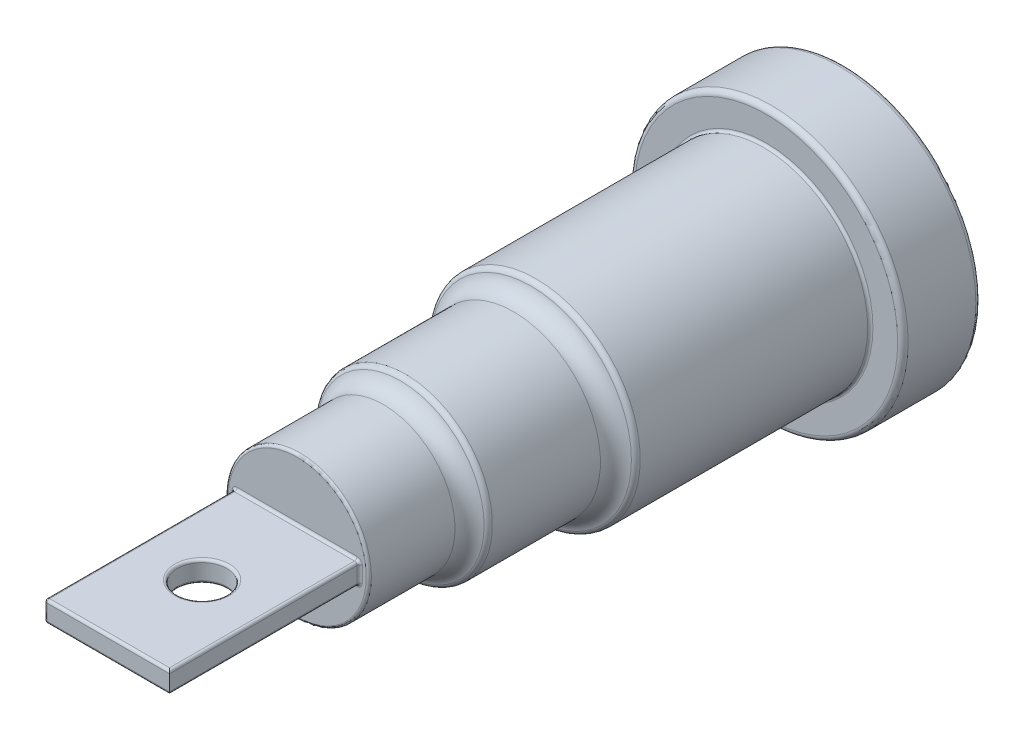
ISO-10303-21;
HEADER;
FILE_DESCRIPTION(('STEP AP214'),'2;1');
FILE_NAME('part.step','',(''),(''),'','','');
FILE_SCHEMA(('AUTOMOTIVE_DESIGN { 1 0 10303 214 1 1 1 1 }'));
ENDSEC;
DATA;
#1=APPLICATION_CONTEXT('core data for automotive mechanical design processes');
#2=APPLICATION_PROTOCOL_DEFINITION('international standard','automotive_design',2000,#1);
#3=PRODUCT_CONTEXT('',#1,'mechanical');
#4=PRODUCT('Part','Part','',(#3));
#5=PRODUCT_RELATED_PRODUCT_CATEGORY('part','',(#4));
#6=PRODUCT_DEFINITION_FORMATION('','',#4);
#7=PRODUCT_DEFINITION_CONTEXT('part definition',#1,'design');
#8=PRODUCT_DEFINITION('design','',#6,#7);
#9=PRODUCT_DEFINITION_SHAPE('','',#8);
#10=(LENGTH_UNIT() NAMED_UNIT(*) SI_UNIT(.MILLI.,.METRE.));
#11=(NAMED_UNIT(*) PLANE_ANGLE_UNIT() SI_UNIT($,.RADIAN.));
#12=(NAMED_UNIT(*) SI_UNIT($,.STERADIAN.) SOLID_ANGLE_UNIT());
#13=UNCERTAINTY_MEASURE_WITH_UNIT(LENGTH_MEASURE(1.E-05),#10,'distance_accuracy_value','');
#14=(GEOMETRIC_REPRESENTATION_CONTEXT(3) GLOBAL_UNCERTAINTY_ASSIGNED_CONTEXT((#13)) GLOBAL_UNIT_ASSIGNED_CONTEXT((#10,
#11,#12)) REPRESENTATION_CONTEXT('',''));
#15=CARTESIAN_POINT('',(0.,0.,0.));
#16=DIRECTION('',(0.,0.,1.));
#17=DIRECTION('',(1.,0.,0.));
#18=AXIS2_PLACEMENT_3D('',#15,#16,#17);
#19=CARTESIAN_POINT('',(0.,0.,3.));
#20=DIRECTION('',(0.,0.,-1.));
#21=DIRECTION('',(-1.,0.,0.));
#22=AXIS2_PLACEMENT_3D('',#19,#20,#21);
#23=CYLINDRICAL_SURFACE('',#22,5.25);
#24=CARTESIAN_POINT('',(0.,0.,2.8));
#25=DIRECTION('',(0.,0.,1.));
#26=DIRECTION('',(1.,0.,0.));
#27=AXIS2_PLACEMENT_3D('',#24,#25,#26);
#28=CIRCLE('',#27,5.25);
#29=CARTESIAN_POINT('',(5.25,0.,2.8));
#30=VERTEX_POINT('',#29);
#31=EDGE_CURVE('E327',#30,#30,#28,.F.);
#32=ORIENTED_EDGE('',*,*,#31,.T.);
#33=EDGE_LOOP('',(#32));
#34=FACE_BOUND('',#33,.T.);
#35=CARTESIAN_POINT('',(0.,0.,0.2));
#36=DIRECTION('',(0.,0.,1.));
#37=DIRECTION('',(1.,0.,0.));
#38=AXIS2_PLACEMENT_3D('',#35,#36,#37);
#39=CIRCLE('',#38,5.25);
#40=CARTESIAN_POINT('',(5.25,0.,0.2));
#41=VERTEX_POINT('',#40);
#42=EDGE_CURVE('E324',#41,#41,#39,.T.);
#43=ORIENTED_EDGE('',*,*,#42,.T.);
#44=EDGE_LOOP('',(#43));
#45=FACE_BOUND('',#44,.T.);
#46=ADVANCED_FACE('F49',(#34,#45),#23,.T.);
#47=CARTESIAN_POINT('',(0.,0.,3.));
#48=DIRECTION('',(0.,0.,1.));
#49=DIRECTION('',(1.,0.,0.));
#50=AXIS2_PLACEMENT_3D('',#47,#48,#49);
#51=PLANE('',#50);
#52=CARTESIAN_POINT('',(0.,0.,3.));
#53=DIRECTION('',(0.,0.,1.));
#54=DIRECTION('',(1.,0.,0.));
#55=AXIS2_PLACEMENT_3D('',#52,#53,#54);
#56=CIRCLE('',#55,5.05);
#57=CARTESIAN_POINT('',(5.05,0.,3.));
#58=VERTEX_POINT('',#57);
#59=EDGE_CURVE('E321',#58,#58,#56,.T.);
#60=ORIENTED_EDGE('',*,*,#59,.T.);
#61=EDGE_LOOP('',(#60));
#62=FACE_BOUND('',#61,.T.);
#63=CARTESIAN_POINT('',(0.,0.,3.));
#64=DIRECTION('',(0.,0.,1.));
#65=DIRECTION('',(1.,0.,0.));
#66=AXIS2_PLACEMENT_3D('',#63,#64,#65);
#67=CIRCLE('',#66,4.1);
#68=CARTESIAN_POINT('',(4.1,0.,3.));
#69=VERTEX_POINT('',#68);
#70=EDGE_CURVE('E300',#69,#69,#67,.F.);
#71=ORIENTED_EDGE('',*,*,#70,.T.);
#72=EDGE_LOOP('',(#71));
#73=FACE_BOUND('',#72,.T.);
#74=ADVANCED_FACE('F349',(#62,#73),#51,.T.);
#75=CARTESIAN_POINT('',(0.,0.,0.));
#76=DIRECTION('',(0.,0.,1.));
#77=DIRECTION('',(1.,0.,0.));
#78=AXIS2_PLACEMENT_3D('',#75,#76,#77);
#79=PLANE('',#78);
#80=CARTESIAN_POINT('',(0.,0.,0.));
#81=DIRECTION('',(0.,0.,1.));
#82=DIRECTION('',(1.,0.,0.));
#83=AXIS2_PLACEMENT_3D('',#80,#81,#82);
#84=CIRCLE('',#83,3.5);
#85=CARTESIAN_POINT('',(3.5,0.,0.));
#86=VERTEX_POINT('',#85);
#87=EDGE_CURVE('E11',#86,#86,#84,.T.);
#88=ORIENTED_EDGE('',*,*,#87,.T.);
#89=EDGE_LOOP('',(#88));
#90=FACE_BOUND('',#89,.T.);
#91=CARTESIAN_POINT('',(0.,0.,0.));
#92=DIRECTION('',(0.,0.,1.));
#93=DIRECTION('',(1.,0.,0.));
#94=AXIS2_PLACEMENT_3D('',#91,#92,#93);
#95=CIRCLE('',#94,5.05);
#96=CARTESIAN_POINT('',(5.05,0.,0.));
#97=VERTEX_POINT('',#96);
#98=EDGE_CURVE('E330',#97,#97,#95,.F.);
#99=ORIENTED_EDGE('',*,*,#98,.T.);
#100=EDGE_LOOP('',(#99));
#101=FACE_BOUND('',#100,.T.);
#102=ADVANCED_FACE('F356',(#90,#101),#79,.F.);
#103=CARTESIAN_POINT('',(0.,0.,12.));
#104=DIRECTION('',(0.,0.,-1.));
#105=DIRECTION('',(-1.,0.,0.));
#106=AXIS2_PLACEMENT_3D('',#103,#104,#105);
#107=CYLINDRICAL_SURFACE('',#106,4.);
#108=CARTESIAN_POINT('',(0.,0.,11.8314462706982));
#109=DIRECTION('',(0.,0.,-1.));
#110=DIRECTION('',(-1.,0.,0.));
#111=AXIS2_PLACEMENT_3D('',#108,#109,#110);
#112=CIRCLE('',#111,4.);
#113=CARTESIAN_POINT('',(-4.,0.,11.8314462706982));
#114=VERTEX_POINT('',#113);
#115=EDGE_CURVE('E318',#114,#114,#112,.T.);
#116=ORIENTED_EDGE('',*,*,#115,.T.);
#117=EDGE_LOOP('',(#116));
#118=FACE_BOUND('',#117,.T.);
#119=CARTESIAN_POINT('',(0.,0.,3.1));
#120=DIRECTION('',(0.,0.,1.));
#121=DIRECTION('',(1.,0.,0.));
#122=AXIS2_PLACEMENT_3D('',#119,#120,#121);
#123=CIRCLE('',#122,4.);
#124=CARTESIAN_POINT('',(4.,0.,3.1));
#125=VERTEX_POINT('',#124);
#126=EDGE_CURVE('E249',#125,#125,#123,.T.);
#127=ORIENTED_EDGE('',*,*,#126,.T.);
#128=EDGE_LOOP('',(#127));
#129=FACE_BOUND('',#128,.T.);
#130=ADVANCED_FACE('F470',(#118,#129),#107,.T.);
#131=CARTESIAN_POINT('',(0.,0.,17.));
#132=DIRECTION('',(0.,0.,-1.));
#133=DIRECTION('',(-1.,0.,0.));
#134=AXIS2_PLACEMENT_3D('',#131,#132,#133);
#135=CYLINDRICAL_SURFACE('',#134,3.34);
#136=CARTESIAN_POINT('',(0.,0.,16.8463770850426));
#137=DIRECTION('',(0.,0.,-1.));
#138=DIRECTION('',(-1.,0.,0.));
#139=AXIS2_PLACEMENT_3D('',#136,#137,#138);
#140=CIRCLE('',#139,3.34);
#141=CARTESIAN_POINT('',(-3.34,0.,16.8463770850426));
#142=VERTEX_POINT('',#141);
#143=EDGE_CURVE('E312',#142,#142,#140,.T.);
#144=ORIENTED_EDGE('',*,*,#143,.T.);
#145=EDGE_LOOP('',(#144));
#146=FACE_BOUND('',#145,.T.);
#147=CARTESIAN_POINT('',(0.,0.,12.6988562083862));
#148=DIRECTION('',(0.,0.,-1.));
#149=DIRECTION('',(-1.,0.,0.));
#150=AXIS2_PLACEMENT_3D('',#147,#148,#149);
#151=CIRCLE('',#150,3.34);
#152=CARTESIAN_POINT('',(-3.34,0.,12.6988562083862));
#153=VERTEX_POINT('',#152);
#154=EDGE_CURVE('E306',#153,#153,#151,.F.);
#155=ORIENTED_EDGE('',*,*,#154,.T.);
#156=EDGE_LOOP('',(#155));
#157=FACE_BOUND('',#156,.T.);
#158=ADVANCED_FACE('F472',(#146,#157),#135,.T.);
#159=CARTESIAN_POINT('',(0.,0.,21.));
#160=DIRECTION('',(0.,0.,-1.));
#161=DIRECTION('',(-1.,0.,0.));
#162=AXIS2_PLACEMENT_3D('',#159,#160,#161);
#163=CYLINDRICAL_SURFACE('',#162,2.75);
#164=CARTESIAN_POINT('',(0.,0.,17.6913031173082));
#165=DIRECTION('',(0.,0.,-1.));
#166=DIRECTION('',(-1.,0.,0.));
#167=AXIS2_PLACEMENT_3D('',#164,#165,#166);
#168=CIRCLE('',#167,2.75);
#169=CARTESIAN_POINT('',(-2.75,0.,17.6913031173082));
#170=VERTEX_POINT('',#169);
#171=EDGE_CURVE('E303',#170,#170,#168,.F.);
#172=ORIENTED_EDGE('',*,*,#171,.T.);
#173=EDGE_LOOP('',(#172));
#174=FACE_BOUND('',#173,.T.);
#175=CARTESIAN_POINT('',(0.,0.,20.9));
#176=DIRECTION('',(0.,0.,1.));
#177=DIRECTION('',(1.,0.,0.));
#178=AXIS2_PLACEMENT_3D('',#175,#176,#177);
#179=CIRCLE('',#178,2.75);
#180=CARTESIAN_POINT('',(2.75,0.,20.9));
#181=VERTEX_POINT('',#180);
#182=EDGE_CURVE('E208',#181,#181,#179,.F.);
#183=ORIENTED_EDGE('',*,*,#182,.T.);
#184=EDGE_LOOP('',(#183));
#185=FACE_BOUND('',#184,.T.);
#186=ADVANCED_FACE('F479',(#174,#185),#163,.T.);
#187=CARTESIAN_POINT('',(0.,0.,21.));
#188=DIRECTION('',(0.,0.,1.));
#189=DIRECTION('',(1.,0.,0.));
#190=AXIS2_PLACEMENT_3D('',#187,#188,#189);
#191=PLANE('',#190);
#192=CARTESIAN_POINT('',(0.,0.,21.));
#193=DIRECTION('',(0.,0.,1.));
#194=DIRECTION('',(1.,0.,0.));
#195=AXIS2_PLACEMENT_3D('',#192,#193,#194);
#196=CIRCLE('',#195,2.65);
#197=CARTESIAN_POINT('',(2.65,0.,21.));
#198=VERTEX_POINT('',#197);
#199=EDGE_CURVE('E205',#198,#198,#196,.T.);
#200=ORIENTED_EDGE('',*,*,#199,.T.);
#201=EDGE_LOOP('',(#200));
#202=FACE_BOUND('',#201,.T.);
#203=CARTESIAN_POINT('',(-2.3,0.3,21.));
#204=DIRECTION('',(0.,0.,1.));
#205=DIRECTION('',(1.,0.,0.));
#206=AXIS2_PLACEMENT_3D('',#203,#204,#205);
#207=CIRCLE('',#206,0.2);
#208=CARTESIAN_POINT('',(-2.3,0.5,21.));
#209=VERTEX_POINT('',#208);
#210=CARTESIAN_POINT('',(-2.5,0.3,21.));
#211=VERTEX_POINT('',#210);
#212=EDGE_CURVE('E197',#209,#211,#207,.T.);
#213=ORIENTED_EDGE('',*,*,#212,.F.);
#214=DIRECTION('',(-1.,0.,0.));
#215=VECTOR('',#214,1.);
#216=CARTESIAN_POINT('',(0.,0.5,21.));
#217=LINE('',#216,#215);
#218=CARTESIAN_POINT('',(2.3,0.5,21.));
#219=VERTEX_POINT('',#218);
#220=EDGE_CURVE('E203',#209,#219,#217,.F.);
#221=ORIENTED_EDGE('',*,*,#220,.T.);
#222=CARTESIAN_POINT('',(2.3,0.3,21.));
#223=DIRECTION('',(0.,0.,1.));
#224=DIRECTION('',(1.,0.,0.));
#225=AXIS2_PLACEMENT_3D('',#222,#223,#224);
#226=CIRCLE('',#225,0.2);
#227=CARTESIAN_POINT('',(2.5,0.3,21.));
#228=VERTEX_POINT('',#227);
#229=EDGE_CURVE('E200',#228,#219,#226,.T.);
#230=ORIENTED_EDGE('',*,*,#229,.F.);
#231=DIRECTION('',(0.,1.,0.));
#232=VECTOR('',#231,1.);
#233=CARTESIAN_POINT('',(2.5,0.,21.));
#234=LINE('',#233,#232);
#235=CARTESIAN_POINT('',(2.5,-0.3,21.));
#236=VERTEX_POINT('',#235);
#237=EDGE_CURVE('E194',#228,#236,#234,.F.);
#238=ORIENTED_EDGE('',*,*,#237,.T.);
#239=CARTESIAN_POINT('',(2.3,-0.3,21.));
#240=DIRECTION('',(0.,0.,1.));
#241=DIRECTION('',(1.,0.,0.));
#242=AXIS2_PLACEMENT_3D('',#239,#240,#241);
#243=CIRCLE('',#242,0.2);
#244=CARTESIAN_POINT('',(2.3,-0.5,21.));
#245=VERTEX_POINT('',#244);
#246=EDGE_CURVE('E191',#245,#236,#243,.T.);
#247=ORIENTED_EDGE('',*,*,#246,.F.);
#248=DIRECTION('',(1.,0.,0.));
#249=VECTOR('',#248,1.);
#250=CARTESIAN_POINT('',(0.,-0.5,21.));
#251=LINE('',#250,#249);
#252=CARTESIAN_POINT('',(-2.3,-0.5,21.));
#253=VERTEX_POINT('',#252);
#254=EDGE_CURVE('E187',#245,#253,#251,.F.);
#255=ORIENTED_EDGE('',*,*,#254,.T.);
#256=CARTESIAN_POINT('',(-2.3,-0.3,21.));
#257=DIRECTION('',(0.,0.,1.));
#258=DIRECTION('',(1.,0.,0.));
#259=AXIS2_PLACEMENT_3D('',#256,#257,#258);
#260=CIRCLE('',#259,0.2);
#261=CARTESIAN_POINT('',(-2.5,-0.3,21.));
#262=VERTEX_POINT('',#261);
#263=EDGE_CURVE('E184',#262,#253,#260,.T.);
#264=ORIENTED_EDGE('',*,*,#263,.F.);
#265=DIRECTION('',(0.,-1.,0.));
#266=VECTOR('',#265,1.);
#267=CARTESIAN_POINT('',(-2.5,0.,21.));
#268=LINE('',#267,#266);
#269=EDGE_CURVE('E189',#262,#211,#268,.F.);
#270=ORIENTED_EDGE('',*,*,#269,.T.);
#271=EDGE_LOOP('',(#213,#221,#230,#238,#247,#255,#264,#270));
#272=FACE_BOUND('',#271,.T.);
#273=ADVANCED_FACE('F486',(#202,#272),#191,.T.);
#274=CARTESIAN_POINT('',(2.4,0.4,28.3));
#275=DIRECTION('',(-1.,0.,0.));
#276=DIRECTION('',(0.,-1.,0.));
#277=AXIS2_PLACEMENT_3D('',#274,#275,#276);
#278=PLANE('',#277);
#279=DIRECTION('',(0.,1.,0.));
#280=VECTOR('',#279,1.);
#281=CARTESIAN_POINT('',(2.4,0.4,21.1));
#282=LINE('',#281,#280);
#283=CARTESIAN_POINT('',(2.4,-0.3,21.1));
#284=VERTEX_POINT('',#283);
#285=CARTESIAN_POINT('',(2.4,0.3,21.1));
#286=VERTEX_POINT('',#285);
#287=EDGE_CURVE('E178',#284,#286,#282,.T.);
#288=ORIENTED_EDGE('',*,*,#287,.T.);
#289=DIRECTION('',(0.,0.,-1.));
#290=VECTOR('',#289,1.);
#291=CARTESIAN_POINT('',(2.4,0.3,28.3));
#292=LINE('',#291,#290);
#293=CARTESIAN_POINT('',(2.4,0.3,28.3));
#294=VERTEX_POINT('',#293);
#295=EDGE_CURVE('E164',#286,#294,#292,.F.);
#296=ORIENTED_EDGE('',*,*,#295,.T.);
#297=DIRECTION('',(0.,1.,0.));
#298=VECTOR('',#297,1.);
#299=CARTESIAN_POINT('',(2.4,0.4,28.3));
#300=LINE('',#299,#298);
#301=CARTESIAN_POINT('',(2.4,-0.3,28.3));
#302=VERTEX_POINT('',#301);
#303=EDGE_CURVE('E147',#302,#294,#300,.T.);
#304=ORIENTED_EDGE('',*,*,#303,.F.);
#305=DIRECTION('',(0.,0.,-1.));
#306=VECTOR('',#305,1.);
#307=CARTESIAN_POINT('',(2.4,-0.3,28.3));
#308=LINE('',#307,#306);
#309=EDGE_CURVE('E161',#302,#284,#308,.T.);
#310=ORIENTED_EDGE('',*,*,#309,.T.);
#311=EDGE_LOOP('',(#288,#296,#304,#310));
#312=FACE_BOUND('',#311,.T.);
#313=ADVANCED_FACE('F159',(#312),#278,.F.);
#314=CARTESIAN_POINT('',(-2.4,0.4,28.3));
#315=DIRECTION('',(0.,-1.,0.));
#316=DIRECTION('',(0.,0.,-1.));
#317=AXIS2_PLACEMENT_3D('',#314,#315,#316);
#318=PLANE('',#317);
#319=CARTESIAN_POINT('',(0.,0.4,24.65));
#320=DIRECTION('',(0.,-1.,0.));
#321=DIRECTION('',(0.,0.,-1.));
#322=AXIS2_PLACEMENT_3D('',#319,#320,#321);
#323=CIRCLE('',#322,1.05);
#324=CARTESIAN_POINT('',(0.,0.4,23.6));
#325=VERTEX_POINT('',#324);
#326=EDGE_CURVE('E155',#325,#325,#323,.T.);
#327=ORIENTED_EDGE('',*,*,#326,.T.);
#328=EDGE_LOOP('',(#327));
#329=FACE_BOUND('',#328,.T.);
#330=DIRECTION('',(-1.,0.,0.));
#331=VECTOR('',#330,1.);
#332=CARTESIAN_POINT('',(2.4,0.4,28.2));
#333=LINE('',#332,#331);
#334=CARTESIAN_POINT('',(-2.3,0.4,28.2));
#335=VERTEX_POINT('',#334);
#336=CARTESIAN_POINT('',(2.3,0.4,28.2));
#337=VERTEX_POINT('',#336);
#338=EDGE_CURVE('E215',#335,#337,#333,.F.);
#339=ORIENTED_EDGE('',*,*,#338,.T.);
#340=DIRECTION('',(0.,0.,-1.));
#341=VECTOR('',#340,1.);
#342=CARTESIAN_POINT('',(2.3,0.4,28.3));
#343=LINE('',#342,#341);
#344=CARTESIAN_POINT('',(2.3,0.4,21.1));
#345=VERTEX_POINT('',#344);
#346=EDGE_CURVE('E217',#337,#345,#343,.T.);
#347=ORIENTED_EDGE('',*,*,#346,.T.);
#348=DIRECTION('',(-1.,0.,0.));
#349=VECTOR('',#348,1.);
#350=CARTESIAN_POINT('',(-2.4,0.4,21.1));
#351=LINE('',#350,#349);
#352=CARTESIAN_POINT('',(-2.3,0.4,21.1));
#353=VERTEX_POINT('',#352);
#354=EDGE_CURVE('E213',#345,#353,#351,.T.);
#355=ORIENTED_EDGE('',*,*,#354,.T.);
#356=DIRECTION('',(0.,0.,-1.));
#357=VECTOR('',#356,1.);
#358=CARTESIAN_POINT('',(-2.3,0.4,28.3));
#359=LINE('',#358,#357);
#360=EDGE_CURVE('E211',#353,#335,#359,.F.);
#361=ORIENTED_EDGE('',*,*,#360,.T.);
#362=EDGE_LOOP('',(#339,#347,#355,#361));
#363=FACE_BOUND('',#362,.T.);
#364=ADVANCED_FACE('F493',(#329,#363),#318,.F.);
#365=CARTESIAN_POINT('',(-2.4,0.4,28.3));
#366=DIRECTION('',(1.,0.,0.));
#367=DIRECTION('',(0.,0.,-1.));
#368=AXIS2_PLACEMENT_3D('',#365,#366,#367);
#369=PLANE('',#368);
#370=DIRECTION('',(0.,-1.,0.));
#371=VECTOR('',#370,1.);
#372=CARTESIAN_POINT('',(-2.4,0.4,28.2));
#373=LINE('',#372,#371);
#374=CARTESIAN_POINT('',(-2.4,-0.3,28.2));
#375=VERTEX_POINT('',#374);
#376=CARTESIAN_POINT('',(-2.4,0.3,28.2));
#377=VERTEX_POINT('',#376);
#378=EDGE_CURVE('E235',#375,#377,#373,.F.);
#379=ORIENTED_EDGE('',*,*,#378,.T.);
#380=DIRECTION('',(0.,0.,-1.));
#381=VECTOR('',#380,1.);
#382=CARTESIAN_POINT('',(-2.4,0.3,28.3));
#383=LINE('',#382,#381);
#384=CARTESIAN_POINT('',(-2.4,0.3,21.1));
#385=VERTEX_POINT('',#384);
#386=EDGE_CURVE('E237',#377,#385,#383,.T.);
#387=ORIENTED_EDGE('',*,*,#386,.T.);
#388=DIRECTION('',(0.,-1.,0.));
#389=VECTOR('',#388,1.);
#390=CARTESIAN_POINT('',(-2.4,0.4,21.1));
#391=LINE('',#390,#389);
#392=CARTESIAN_POINT('',(-2.4,-0.3,21.1));
#393=VERTEX_POINT('',#392);
#394=EDGE_CURVE('E233',#385,#393,#391,.T.);
#395=ORIENTED_EDGE('',*,*,#394,.T.);
#396=DIRECTION('',(0.,0.,-1.));
#397=VECTOR('',#396,1.);
#398=CARTESIAN_POINT('',(-2.4,-0.3,28.3));
#399=LINE('',#398,#397);
#400=EDGE_CURVE('E231',#393,#375,#399,.F.);
#401=ORIENTED_EDGE('',*,*,#400,.T.);
#402=EDGE_LOOP('',(#379,#387,#395,#401));
#403=FACE_BOUND('',#402,.T.);
#404=ADVANCED_FACE('F496',(#403),#369,.F.);
#405=CARTESIAN_POINT('',(-2.4,-0.4,28.3));
#406=DIRECTION('',(0.,1.,0.));
#407=DIRECTION('',(0.,0.,1.));
#408=AXIS2_PLACEMENT_3D('',#405,#406,#407);
#409=PLANE('',#408);
#410=DIRECTION('',(1.,0.,0.));
#411=VECTOR('',#410,1.);
#412=CARTESIAN_POINT('',(-2.4,-0.4,28.2));
#413=LINE('',#412,#411);
#414=CARTESIAN_POINT('',(2.3,-0.4,28.2));
#415=VERTEX_POINT('',#414);
#416=CARTESIAN_POINT('',(-2.3,-0.4,28.2));
#417=VERTEX_POINT('',#416);
#418=EDGE_CURVE('E65',#415,#417,#413,.F.);
#419=ORIENTED_EDGE('',*,*,#418,.T.);
#420=DIRECTION('',(0.,0.,-1.));
#421=VECTOR('',#420,1.);
#422=CARTESIAN_POINT('',(-2.3,-0.4,28.3));
#423=LINE('',#422,#421);
#424=CARTESIAN_POINT('',(-2.3,-0.4,21.1));
#425=VERTEX_POINT('',#424);
#426=EDGE_CURVE('E247',#417,#425,#423,.T.);
#427=ORIENTED_EDGE('',*,*,#426,.T.);
#428=DIRECTION('',(1.,0.,0.));
#429=VECTOR('',#428,1.);
#430=CARTESIAN_POINT('',(-2.4,-0.4,21.1));
#431=LINE('',#430,#429);
#432=CARTESIAN_POINT('',(2.3,-0.4,21.1));
#433=VERTEX_POINT('',#432);
#434=EDGE_CURVE('E243',#425,#433,#431,.T.);
#435=ORIENTED_EDGE('',*,*,#434,.T.);
#436=DIRECTION('',(0.,0.,-1.));
#437=VECTOR('',#436,1.);
#438=CARTESIAN_POINT('',(2.3,-0.4,28.3));
#439=LINE('',#438,#437);
#440=EDGE_CURVE('E70',#433,#415,#439,.F.);
#441=ORIENTED_EDGE('',*,*,#440,.T.);
#442=EDGE_LOOP('',(#419,#427,#435,#441));
#443=FACE_BOUND('',#442,.T.);
#444=CARTESIAN_POINT('',(0.,-0.4,24.65));
#445=DIRECTION('',(0.,1.,0.));
#446=DIRECTION('',(0.,0.,1.));
#447=AXIS2_PLACEMENT_3D('',#444,#445,#446);
#448=CIRCLE('',#447,1.05);
#449=CARTESIAN_POINT('',(0.,-0.4,25.7));
#450=VERTEX_POINT('',#449);
#451=EDGE_CURVE('E240',#450,#450,#448,.T.);
#452=ORIENTED_EDGE('',*,*,#451,.T.);
#453=EDGE_LOOP('',(#452));
#454=FACE_BOUND('',#453,.T.);
#455=ADVANCED_FACE('F500',(#443,#454),#409,.F.);
#456=CARTESIAN_POINT('',(0.,0.,28.3));
#457=DIRECTION('',(0.,0.,1.));
#458=DIRECTION('',(1.,0.,0.));
#459=AXIS2_PLACEMENT_3D('',#456,#457,#458);
#460=PLANE('',#459);
#461=ORIENTED_EDGE('',*,*,#303,.T.);
#462=DIRECTION('',(-1.,0.,0.));
#463=VECTOR('',#462,1.);
#464=CARTESIAN_POINT('',(-2.4,0.3,28.3));
#465=LINE('',#464,#463);
#466=CARTESIAN_POINT('',(-2.3,0.3,28.3));
#467=VERTEX_POINT('',#466);
#468=EDGE_CURVE('E223',#294,#467,#465,.T.);
#469=ORIENTED_EDGE('',*,*,#468,.T.);
#470=DIRECTION('',(0.,-1.,0.));
#471=VECTOR('',#470,1.);
#472=CARTESIAN_POINT('',(-2.3,-0.4,28.3));
#473=LINE('',#472,#471);
#474=CARTESIAN_POINT('',(-2.3,-0.3,28.3));
#475=VERTEX_POINT('',#474);
#476=EDGE_CURVE('E150',#467,#475,#473,.T.);
#477=ORIENTED_EDGE('',*,*,#476,.T.);
#478=DIRECTION('',(1.,0.,0.));
#479=VECTOR('',#478,1.);
#480=CARTESIAN_POINT('',(2.4,-0.3,28.3));
#481=LINE('',#480,#479);
#482=EDGE_CURVE('E144',#475,#302,#481,.T.);
#483=ORIENTED_EDGE('',*,*,#482,.T.);
#484=EDGE_LOOP('',(#461,#469,#477,#483));
#485=FACE_BOUND('',#484,.T.);
#486=ADVANCED_FACE('F146',(#485),#460,.T.);
#487=CARTESIAN_POINT('',(0.,5.25,24.65));
#488=DIRECTION('',(0.,-1.,0.));
#489=DIRECTION('',(0.,0.,-1.));
#490=AXIS2_PLACEMENT_3D('',#487,#488,#489);
#491=CYLINDRICAL_SURFACE('',#490,0.95);
#492=CARTESIAN_POINT('',(0.,0.3,24.65));
#493=DIRECTION('',(0.,-1.,0.));
#494=DIRECTION('',(0.,0.,-1.));
#495=AXIS2_PLACEMENT_3D('',#492,#493,#494);
#496=CIRCLE('',#495,0.95);
#497=CARTESIAN_POINT('',(0.,0.300000000000001,23.7));
#498=VERTEX_POINT('',#497);
#499=EDGE_CURVE('E228',#498,#498,#496,.F.);
#500=CARTESIAN_POINT('',(0.,-0.3,24.65));
#501=DIRECTION('',(0.,1.,0.));
#502=DIRECTION('',(0.,0.,1.));
#503=AXIS2_PLACEMENT_3D('',#500,#501,#502);
#504=CIRCLE('',#503,0.95);
#505=CARTESIAN_POINT('',(0.,-0.300000000000001,23.7));
#506=VERTEX_POINT('',#505);
#507=EDGE_CURVE('E225',#506,#506,#504,.F.);
#508=CARTESIAN_POINT('',(0.,0.300000000000001,23.7));
#509=CARTESIAN_POINT('',(0.,0.293750000000001,23.7));
#510=CARTESIAN_POINT('',(0.,0.287500000000001,23.7));
#511=CARTESIAN_POINT('',(0.,0.275000000000001,23.7));
#512=CARTESIAN_POINT('',(0.,0.268750000000001,23.7));
#513=CARTESIAN_POINT('',(0.,0.256250000000001,23.7));
#514=CARTESIAN_POINT('',(0.,0.250000000000001,23.7));
#515=CARTESIAN_POINT('',(0.,0.237500000000001,23.7));
#516=CARTESIAN_POINT('',(0.,0.231250000000001,23.7));
#517=CARTESIAN_POINT('',(0.,0.21875,23.7));
#518=CARTESIAN_POINT('',(0.,0.212500000000001,23.7));
#519=CARTESIAN_POINT('',(0.,0.200000000000001,23.7));
#520=CARTESIAN_POINT('',(0.,0.19375,23.7));
#521=CARTESIAN_POINT('',(0.,0.18125,23.7));
#522=CARTESIAN_POINT('',(0.,0.175,23.7));
#523=CARTESIAN_POINT('',(0.,0.1625,23.7));
#524=CARTESIAN_POINT('',(0.,0.15625,23.7));
#525=CARTESIAN_POINT('',(0.,0.14375,23.7));
#526=CARTESIAN_POINT('',(0.,0.1375,23.7));
#527=CARTESIAN_POINT('',(0.,0.125,23.7));
#528=CARTESIAN_POINT('',(0.,0.118750000000001,23.7));
#529=CARTESIAN_POINT('',(0.,0.10625,23.7));
#530=CARTESIAN_POINT('',(0.,0.1,23.7));
#531=CARTESIAN_POINT('',(0.,0.0875000000000002,23.7));
#532=CARTESIAN_POINT('',(0.,0.0812500000000003,23.7));
#533=CARTESIAN_POINT('',(0.,0.0687500000000002,23.7));
#534=CARTESIAN_POINT('',(0.,0.0625000000000001,23.7));
#535=CARTESIAN_POINT('',(0.,0.05,23.7));
#536=CARTESIAN_POINT('',(0.,0.0437500000000001,23.7));
#537=CARTESIAN_POINT('',(0.,0.03125,23.7));
#538=CARTESIAN_POINT('',(0.,0.0249999999999998,23.7));
#539=CARTESIAN_POINT('',(0.,0.0124999999999998,23.7));
#540=CARTESIAN_POINT('',(0.,0.00624999999999989,23.7));
#541=CARTESIAN_POINT('',(0.,-0.00624999999999989,23.7));
#542=CARTESIAN_POINT('',(0.,-0.0124999999999998,23.7));
#543=CARTESIAN_POINT('',(0.,-0.0249999999999999,23.7));
#544=CARTESIAN_POINT('',(0.,-0.03125,23.7));
#545=CARTESIAN_POINT('',(0.,-0.0437500000000001,23.7));
#546=CARTESIAN_POINT('',(0.,-0.05,23.7));
#547=CARTESIAN_POINT('',(0.,-0.0625000000000001,23.7));
#548=CARTESIAN_POINT('',(0.,-0.0687500000000002,23.7));
#549=CARTESIAN_POINT('',(0.,-0.0812500000000003,23.7));
#550=CARTESIAN_POINT('',(0.,-0.0875000000000002,23.7));
#551=CARTESIAN_POINT('',(0.,-0.1,23.7));
#552=CARTESIAN_POINT('',(0.,-0.10625,23.7));
#553=CARTESIAN_POINT('',(0.,-0.118750000000001,23.7));
#554=CARTESIAN_POINT('',(0.,-0.125,23.7));
#555=CARTESIAN_POINT('',(0.,-0.1375,23.7));
#556=CARTESIAN_POINT('',(0.,-0.14375,23.7));
#557=CARTESIAN_POINT('',(0.,-0.15625,23.7));
#558=CARTESIAN_POINT('',(0.,-0.1625,23.7));
#559=CARTESIAN_POINT('',(0.,-0.175,23.7));
#560=CARTESIAN_POINT('',(0.,-0.18125,23.7));
#561=CARTESIAN_POINT('',(0.,-0.19375,23.7));
#562=CARTESIAN_POINT('',(0.,-0.200000000000001,23.7));
#563=CARTESIAN_POINT('',(0.,-0.212500000000001,23.7));
#564=CARTESIAN_POINT('',(0.,-0.21875,23.7));
#565=CARTESIAN_POINT('',(0.,-0.231250000000001,23.7));
#566=CARTESIAN_POINT('',(0.,-0.237500000000001,23.7));
#567=CARTESIAN_POINT('',(0.,-0.250000000000001,23.7));
#568=CARTESIAN_POINT('',(0.,-0.256250000000001,23.7));
#569=CARTESIAN_POINT('',(0.,-0.268750000000001,23.7));
#570=CARTESIAN_POINT('',(0.,-0.275000000000001,23.7));
#571=CARTESIAN_POINT('',(0.,-0.287500000000001,23.7));
#572=CARTESIAN_POINT('',(0.,-0.293750000000001,23.7));
#573=CARTESIAN_POINT('',(0.,-0.300000000000001,23.7));
#574=B_SPLINE_CURVE_WITH_KNOTS('',3,(#508,#509,#510,#511,#512,#513,#514,#515,#516,#517,#518,
#519,#520,#521,#522,#523,#524,#525,#526,#527,#528,#529,#530,#531,#532,#533,#534,#535,#536,#537,
#538,#539,#540,#541,#542,#543,#544,#545,#546,#547,#548,#549,#550,#551,#552,#553,#554,#555,#556,
#557,#558,#559,#560,#561,#562,#563,#564,#565,#566,#567,#568,#569,#570,#571,#572,#573),
.UNSPECIFIED.,.F.,.F.,(4,2,2,2,2,2,2,2,2,2,2,2,2,2,2,2,2,2,2,2,2,2,2,2,2,2,2,2,2,2,2,2,4),(0.,
0.0187499999999997,0.0375000000000002,0.0562499999999999,0.0750000000000004,0.0937500000000001,
0.112500000000001,0.13125,0.150000000000001,0.168750000000001,0.1875,0.206250000000001,0.225,
0.243750000000001,0.262500000000001,0.281250000000001,0.300000000000001,0.31875,
0.337500000000001,0.356250000000001,0.375000000000001,0.393750000000001,0.412500000000001,
0.431250000000001,0.450000000000001,0.468750000000001,0.487500000000001,0.506250000000002,
0.525000000000001,0.543750000000002,0.562500000000001,0.581250000000002,0.600000000000002),.UNSPECIFIED.);
#575=EDGE_CURVE('BSEAM506',#498,#506,#574,.T.);
#576=ORIENTED_EDGE('',*,*,#499,.T.);
#577=ORIENTED_EDGE('',*,*,#507,.T.);
#578=ORIENTED_EDGE('',*,*,#575,.T.);
#579=ORIENTED_EDGE('',*,*,#575,.F.);
#580=EDGE_LOOP('',(#576,#578,#577,#579));
#581=FACE_BOUND('',#580,.T.);
#582=ADVANCED_FACE('F506',(#581),#491,.F.);
#583=CARTESIAN_POINT('',(0.,0.,15.));
#584=DIRECTION('',(0.,0.,-1.));
#585=DIRECTION('',(-1.,0.,0.));
#586=AXIS2_PLACEMENT_3D('',#583,#584,#585);
#587=CYLINDRICAL_SURFACE('',#586,2.5);
#588=CARTESIAN_POINT('',(0.,0.,0.999999999999994));
#589=DIRECTION('',(0.,0.,1.));
#590=DIRECTION('',(1.,0.,0.));
#591=AXIS2_PLACEMENT_3D('',#588,#589,#590);
#592=CIRCLE('',#591,2.5);
#593=CARTESIAN_POINT('',(2.5,0.,0.999999999999994));
#594=VERTEX_POINT('',#593);
#595=EDGE_CURVE('E58',#594,#594,#592,.F.);
#596=ORIENTED_EDGE('',*,*,#595,.T.);
#597=EDGE_LOOP('',(#596));
#598=FACE_BOUND('',#597,.T.);
#599=CARTESIAN_POINT('',(0.,0.,15.));
#600=DIRECTION('',(0.,0.,-1.));
#601=DIRECTION('',(-1.,0.,0.));
#602=AXIS2_PLACEMENT_3D('',#599,#600,#601);
#603=CIRCLE('',#602,2.5);
#604=CARTESIAN_POINT('',(-2.5,0.,15.));
#605=VERTEX_POINT('',#604);
#606=EDGE_CURVE('E165',#605,#605,#603,.T.);
#607=ORIENTED_EDGE('',*,*,#606,.F.);
#608=EDGE_LOOP('',(#607));
#609=FACE_BOUND('',#608,.T.);
#610=ADVANCED_FACE('F335',(#598,#609),#587,.F.);
#611=CARTESIAN_POINT('',(0.,0.,15.));
#612=DIRECTION('',(0.,0.,-1.));
#613=DIRECTION('',(-1.,0.,0.));
#614=AXIS2_PLACEMENT_3D('',#611,#612,#613);
#615=PLANE('',#614);
#616=ORIENTED_EDGE('',*,*,#606,.T.);
#617=EDGE_LOOP('',(#616));
#618=FACE_BOUND('',#617,.T.);
#619=ADVANCED_FACE('F426',(#618),#615,.T.);
#620=CARTESIAN_POINT('',(-2.3,0.,28.2));
#621=DIRECTION('',(0.,1.,0.));
#622=DIRECTION('',(0.,0.,1.));
#623=AXIS2_PLACEMENT_3D('',#620,#621,#622);
#624=CYLINDRICAL_SURFACE('',#623,0.1);
#625=CARTESIAN_POINT('',(-2.3,0.3,28.2));
#626=DIRECTION('',(0.,1.,0.));
#627=DIRECTION('',(0.,0.,1.));
#628=AXIS2_PLACEMENT_3D('',#625,#626,#627);
#629=CIRCLE('',#628,0.1);
#630=EDGE_CURVE('E289',#377,#467,#629,.T.);
#631=ORIENTED_EDGE('',*,*,#630,.F.);
#632=ORIENTED_EDGE('',*,*,#378,.F.);
#633=CARTESIAN_POINT('',(-2.3,-0.3,28.2));
#634=DIRECTION('',(0.,-1.,0.));
#635=DIRECTION('',(0.,0.,-1.));
#636=AXIS2_PLACEMENT_3D('',#633,#634,#635);
#637=CIRCLE('',#636,0.1);
#638=EDGE_CURVE('E292',#475,#375,#637,.T.);
#639=ORIENTED_EDGE('',*,*,#638,.F.);
#640=ORIENTED_EDGE('',*,*,#476,.F.);
#641=EDGE_LOOP('',(#631,#632,#639,#640));
#642=FACE_BOUND('',#641,.T.);
#643=ADVANCED_FACE('F422',(#642),#624,.T.);
#644=CARTESIAN_POINT('',(-2.3,-0.3,28.3));
#645=DIRECTION('',(0.,0.,-1.));
#646=DIRECTION('',(-1.,0.,0.));
#647=AXIS2_PLACEMENT_3D('',#644,#645,#646);
#648=CYLINDRICAL_SURFACE('',#647,0.1);
#649=CARTESIAN_POINT('',(-2.3,-0.3,28.2));
#650=DIRECTION('',(0.,0.,1.));
#651=DIRECTION('',(1.,0.,0.));
#652=AXIS2_PLACEMENT_3D('',#649,#650,#651);
#653=CIRCLE('',#652,0.1);
#654=EDGE_CURVE('E295',#375,#417,#653,.T.);
#655=ORIENTED_EDGE('',*,*,#654,.F.);
#656=ORIENTED_EDGE('',*,*,#400,.F.);
#657=CARTESIAN_POINT('',(-2.3,-0.3,21.1));
#658=DIRECTION('',(0.,0.,1.));
#659=DIRECTION('',(1.,0.,0.));
#660=AXIS2_PLACEMENT_3D('',#657,#658,#659);
#661=CIRCLE('',#660,0.1);
#662=EDGE_CURVE('E280',#425,#393,#661,.F.);
#663=ORIENTED_EDGE('',*,*,#662,.F.);
#664=ORIENTED_EDGE('',*,*,#426,.F.);
#665=EDGE_LOOP('',(#655,#656,#663,#664));
#666=FACE_BOUND('',#665,.T.);
#667=ADVANCED_FACE('F418',(#666),#648,.T.);
#668=CARTESIAN_POINT('',(-2.3,-0.3,28.2));
#669=DIRECTION('',(-1.,0.,0.));
#670=DIRECTION('',(0.,0.,1.));
#671=AXIS2_PLACEMENT_3D('',#668,#669,#670);
#672=SPHERICAL_SURFACE('',#671,0.1);
#673=ORIENTED_EDGE('',*,*,#638,.T.);
#674=ORIENTED_EDGE('',*,*,#654,.T.);
#675=CARTESIAN_POINT('',(-2.3,-0.3,28.2));
#676=DIRECTION('',(-1.,0.,0.));
#677=DIRECTION('',(0.,0.,1.));
#678=AXIS2_PLACEMENT_3D('',#675,#676,#677);
#679=CIRCLE('',#678,0.1);
#680=EDGE_CURVE('E278',#475,#417,#679,.F.);
#681=ORIENTED_EDGE('',*,*,#680,.F.);
#682=EDGE_LOOP('',(#673,#674,#681));
#683=FACE_BOUND('',#682,.T.);
#684=ADVANCED_FACE('F414',(#683),#672,.T.);
#685=CARTESIAN_POINT('',(-2.3,0.3,28.2));
#686=DIRECTION('',(-1.,0.,0.));
#687=DIRECTION('',(0.,0.,1.));
#688=AXIS2_PLACEMENT_3D('',#685,#686,#687);
#689=SPHERICAL_SURFACE('',#688,0.1);
#690=CARTESIAN_POINT('',(-2.3,0.3,28.2));
#691=DIRECTION('',(-1.,0.,0.));
#692=DIRECTION('',(0.,0.,1.));
#693=AXIS2_PLACEMENT_3D('',#690,#691,#692);
#694=CIRCLE('',#693,0.1);
#695=EDGE_CURVE('E275',#335,#467,#694,.F.);
#696=ORIENTED_EDGE('',*,*,#695,.F.);
#697=CARTESIAN_POINT('',(-2.3,0.3,28.2));
#698=DIRECTION('',(0.,0.,1.));
#699=DIRECTION('',(1.,0.,0.));
#700=AXIS2_PLACEMENT_3D('',#697,#698,#699);
#701=CIRCLE('',#700,0.1);
#702=EDGE_CURVE('E286',#377,#335,#701,.F.);
#703=ORIENTED_EDGE('',*,*,#702,.F.);
#704=ORIENTED_EDGE('',*,*,#630,.T.);
#705=EDGE_LOOP('',(#696,#703,#704));
#706=FACE_BOUND('',#705,.T.);
#707=ADVANCED_FACE('F410',(#706),#689,.T.);
#708=CARTESIAN_POINT('',(-2.3,0.3,28.3));
#709=DIRECTION('',(0.,0.,-1.));
#710=DIRECTION('',(-1.,0.,0.));
#711=AXIS2_PLACEMENT_3D('',#708,#709,#710);
#712=CYLINDRICAL_SURFACE('',#711,0.1);
#713=ORIENTED_EDGE('',*,*,#702,.T.);
#714=ORIENTED_EDGE('',*,*,#360,.F.);
#715=CARTESIAN_POINT('',(-2.3,0.3,21.1));
#716=DIRECTION('',(0.,0.,1.));
#717=DIRECTION('',(1.,0.,0.));
#718=AXIS2_PLACEMENT_3D('',#715,#716,#717);
#719=CIRCLE('',#718,0.1);
#720=EDGE_CURVE('E272',#385,#353,#719,.F.);
#721=ORIENTED_EDGE('',*,*,#720,.F.);
#722=ORIENTED_EDGE('',*,*,#386,.F.);
#723=EDGE_LOOP('',(#713,#714,#721,#722));
#724=FACE_BOUND('',#723,.T.);
#725=ADVANCED_FACE('F406',(#724),#712,.T.);
#726=CARTESIAN_POINT('',(-2.5,0.4,21.1));
#727=DIRECTION('',(0.,-1.,0.));
#728=DIRECTION('',(0.,0.,-1.));
#729=AXIS2_PLACEMENT_3D('',#726,#727,#728);
#730=CYLINDRICAL_SURFACE('',#729,0.1);
#731=CARTESIAN_POINT('',(-2.5,0.3,21.1));
#732=DIRECTION('',(0.,-1.,0.));
#733=DIRECTION('',(0.,0.,-1.));
#734=AXIS2_PLACEMENT_3D('',#731,#732,#733);
#735=CIRCLE('',#734,0.1);
#736=EDGE_CURVE('E270',#211,#385,#735,.T.);
#737=ORIENTED_EDGE('',*,*,#736,.F.);
#738=ORIENTED_EDGE('',*,*,#269,.F.);
#739=CARTESIAN_POINT('',(-2.5,-0.3,21.1));
#740=DIRECTION('',(0.,1.,0.));
#741=DIRECTION('',(0.,0.,1.));
#742=AXIS2_PLACEMENT_3D('',#739,#740,#741);
#743=CIRCLE('',#742,0.1);
#744=EDGE_CURVE('E283',#393,#262,#743,.T.);
#745=ORIENTED_EDGE('',*,*,#744,.F.);
#746=ORIENTED_EDGE('',*,*,#394,.F.);
#747=EDGE_LOOP('',(#737,#738,#745,#746));
#748=FACE_BOUND('',#747,.T.);
#749=ADVANCED_FACE('F402',(#748),#730,.F.);
#750=CARTESIAN_POINT('',(-2.3,-0.3,21.1));
#751=DIRECTION('',(0.,0.,1.));
#752=DIRECTION('',(1.,0.,0.));
#753=AXIS2_PLACEMENT_3D('',#750,#751,#752);
#754=TOROIDAL_SURFACE('',#753,0.2,0.1);
#755=ORIENTED_EDGE('',*,*,#744,.T.);
#756=ORIENTED_EDGE('',*,*,#263,.T.);
#757=CARTESIAN_POINT('',(-2.3,-0.5,21.1));
#758=DIRECTION('',(1.,0.,0.));
#759=DIRECTION('',(0.,0.,-1.));
#760=AXIS2_PLACEMENT_3D('',#757,#758,#759);
#761=CIRCLE('',#760,0.1);
#762=EDGE_CURVE('E171',#425,#253,#761,.F.);
#763=ORIENTED_EDGE('',*,*,#762,.F.);
#764=ORIENTED_EDGE('',*,*,#662,.T.);
#765=EDGE_LOOP('',(#755,#756,#763,#764));
#766=FACE_BOUND('',#765,.T.);
#767=ADVANCED_FACE('F399',(#766),#754,.F.);
#768=CARTESIAN_POINT('',(0.,-0.3,28.2));
#769=DIRECTION('',(-1.,0.,0.));
#770=DIRECTION('',(0.,0.,1.));
#771=AXIS2_PLACEMENT_3D('',#768,#769,#770);
#772=CYLINDRICAL_SURFACE('',#771,0.1);
#773=ORIENTED_EDGE('',*,*,#680,.T.);
#774=ORIENTED_EDGE('',*,*,#418,.F.);
#775=CARTESIAN_POINT('',(2.3,-0.3,28.2));
#776=DIRECTION('',(0.707106781186547,0.,-0.707106781186547));
#777=DIRECTION('',(-0.707106781186547,0.,-0.707106781186547));
#778=AXIS2_PLACEMENT_3D('',#775,#776,#777);
#779=ELLIPSE('',#778,0.14142135623731,0.1);
#780=EDGE_CURVE('E168',#302,#415,#779,.T.);
#781=ORIENTED_EDGE('',*,*,#780,.F.);
#782=ORIENTED_EDGE('',*,*,#482,.F.);
#783=EDGE_LOOP('',(#773,#774,#781,#782));
#784=FACE_BOUND('',#783,.T.);
#785=ADVANCED_FACE('F169',(#784),#772,.T.);
#786=CARTESIAN_POINT('',(0.,0.3,28.2));
#787=DIRECTION('',(1.,0.,0.));
#788=DIRECTION('',(0.,0.,-1.));
#789=AXIS2_PLACEMENT_3D('',#786,#787,#788);
#790=CYLINDRICAL_SURFACE('',#789,0.1);
#791=ORIENTED_EDGE('',*,*,#695,.T.);
#792=ORIENTED_EDGE('',*,*,#468,.F.);
#793=CARTESIAN_POINT('',(2.3,0.3,28.2));
#794=DIRECTION('',(0.707106781186547,0.,-0.707106781186547));
#795=DIRECTION('',(0.707106781186547,0.,0.707106781186547));
#796=AXIS2_PLACEMENT_3D('',#793,#794,#795);
#797=ELLIPSE('',#796,0.14142135623731,0.1);
#798=EDGE_CURVE('E172',#337,#294,#797,.T.);
#799=ORIENTED_EDGE('',*,*,#798,.F.);
#800=ORIENTED_EDGE('',*,*,#338,.F.);
#801=EDGE_LOOP('',(#791,#792,#799,#800));
#802=FACE_BOUND('',#801,.T.);
#803=ADVANCED_FACE('F392',(#802),#790,.T.);
#804=CARTESIAN_POINT('',(-2.3,0.3,21.1));
#805=DIRECTION('',(0.,0.,1.));
#806=DIRECTION('',(1.,0.,0.));
#807=AXIS2_PLACEMENT_3D('',#804,#805,#806);
#808=TOROIDAL_SURFACE('',#807,0.2,0.1);
#809=ORIENTED_EDGE('',*,*,#736,.T.);
#810=ORIENTED_EDGE('',*,*,#720,.T.);
#811=CARTESIAN_POINT('',(-2.3,0.5,21.1));
#812=DIRECTION('',(1.,0.,0.));
#813=DIRECTION('',(0.,0.,-1.));
#814=AXIS2_PLACEMENT_3D('',#811,#812,#813);
#815=CIRCLE('',#814,0.1);
#816=EDGE_CURVE('E263',#209,#353,#815,.F.);
#817=ORIENTED_EDGE('',*,*,#816,.F.);
#818=ORIENTED_EDGE('',*,*,#212,.T.);
#819=EDGE_LOOP('',(#809,#810,#817,#818));
#820=FACE_BOUND('',#819,.T.);
#821=ADVANCED_FACE('F388',(#820),#808,.F.);
#822=CARTESIAN_POINT('',(-2.4,-0.5,21.1));
#823=DIRECTION('',(1.,0.,0.));
#824=DIRECTION('',(0.,0.,-1.));
#825=AXIS2_PLACEMENT_3D('',#822,#823,#824);
#826=CYLINDRICAL_SURFACE('',#825,0.1);
#827=ORIENTED_EDGE('',*,*,#762,.T.);
#828=ORIENTED_EDGE('',*,*,#254,.F.);
#829=CARTESIAN_POINT('',(2.3,-0.5,21.1));
#830=DIRECTION('',(-1.,0.,0.));
#831=DIRECTION('',(0.,0.,1.));
#832=AXIS2_PLACEMENT_3D('',#829,#830,#831);
#833=CIRCLE('',#832,0.1);
#834=EDGE_CURVE('E260',#433,#245,#833,.T.);
#835=ORIENTED_EDGE('',*,*,#834,.F.);
#836=ORIENTED_EDGE('',*,*,#434,.F.);
#837=EDGE_LOOP('',(#827,#828,#835,#836));
#838=FACE_BOUND('',#837,.T.);
#839=ADVANCED_FACE('F385',(#838),#826,.F.);
#840=CARTESIAN_POINT('',(2.3,-0.3,28.3));
#841=DIRECTION('',(0.,0.,-1.));
#842=DIRECTION('',(-1.,0.,0.));
#843=AXIS2_PLACEMENT_3D('',#840,#841,#842);
#844=CYLINDRICAL_SURFACE('',#843,0.1);
#845=ORIENTED_EDGE('',*,*,#780,.T.);
#846=ORIENTED_EDGE('',*,*,#440,.F.);
#847=CARTESIAN_POINT('',(2.3,-0.3,21.1));
#848=DIRECTION('',(0.,0.,1.));
#849=DIRECTION('',(1.,0.,0.));
#850=AXIS2_PLACEMENT_3D('',#847,#848,#849);
#851=CIRCLE('',#850,0.1);
#852=EDGE_CURVE('E176',#284,#433,#851,.F.);
#853=ORIENTED_EDGE('',*,*,#852,.F.);
#854=ORIENTED_EDGE('',*,*,#309,.F.);
#855=EDGE_LOOP('',(#845,#846,#853,#854));
#856=FACE_BOUND('',#855,.T.);
#857=ADVANCED_FACE('F174',(#856),#844,.T.);
#858=CARTESIAN_POINT('',(2.3,0.3,28.3));
#859=DIRECTION('',(0.,0.,-1.));
#860=DIRECTION('',(-1.,0.,0.));
#861=AXIS2_PLACEMENT_3D('',#858,#859,#860);
#862=CYLINDRICAL_SURFACE('',#861,0.1);
#863=ORIENTED_EDGE('',*,*,#798,.T.);
#864=ORIENTED_EDGE('',*,*,#295,.F.);
#865=CARTESIAN_POINT('',(2.3,0.3,21.1));
#866=DIRECTION('',(0.,0.,1.));
#867=DIRECTION('',(1.,0.,0.));
#868=AXIS2_PLACEMENT_3D('',#865,#866,#867);
#869=CIRCLE('',#868,0.1);
#870=EDGE_CURVE('E256',#345,#286,#869,.F.);
#871=ORIENTED_EDGE('',*,*,#870,.F.);
#872=ORIENTED_EDGE('',*,*,#346,.F.);
#873=EDGE_LOOP('',(#863,#864,#871,#872));
#874=FACE_BOUND('',#873,.T.);
#875=ADVANCED_FACE('F378',(#874),#862,.T.);
#876=CARTESIAN_POINT('',(-2.4,0.5,21.1));
#877=DIRECTION('',(-1.,0.,0.));
#878=DIRECTION('',(0.,0.,1.));
#879=AXIS2_PLACEMENT_3D('',#876,#877,#878);
#880=CYLINDRICAL_SURFACE('',#879,0.1);
#881=ORIENTED_EDGE('',*,*,#816,.T.);
#882=ORIENTED_EDGE('',*,*,#354,.F.);
#883=CARTESIAN_POINT('',(2.3,0.5,21.1));
#884=DIRECTION('',(-1.,0.,0.));
#885=DIRECTION('',(0.,0.,1.));
#886=AXIS2_PLACEMENT_3D('',#883,#884,#885);
#887=CIRCLE('',#886,0.1);
#888=EDGE_CURVE('E254',#219,#345,#887,.T.);
#889=ORIENTED_EDGE('',*,*,#888,.F.);
#890=ORIENTED_EDGE('',*,*,#220,.F.);
#891=EDGE_LOOP('',(#881,#882,#889,#890));
#892=FACE_BOUND('',#891,.T.);
#893=ADVANCED_FACE('F374',(#892),#880,.F.);
#894=CARTESIAN_POINT('',(2.3,-0.3,21.1));
#895=DIRECTION('',(0.,0.,1.));
#896=DIRECTION('',(1.,0.,0.));
#897=AXIS2_PLACEMENT_3D('',#894,#895,#896);
#898=TOROIDAL_SURFACE('',#897,0.2,0.1);
#899=ORIENTED_EDGE('',*,*,#834,.T.);
#900=ORIENTED_EDGE('',*,*,#246,.T.);
#901=CARTESIAN_POINT('',(2.5,-0.3,21.1));
#902=DIRECTION('',(0.,1.,0.));
#903=DIRECTION('',(-1.,0.,0.));
#904=AXIS2_PLACEMENT_3D('',#901,#902,#903);
#905=CIRCLE('',#904,0.1);
#906=EDGE_CURVE('E252',#284,#236,#905,.F.);
#907=ORIENTED_EDGE('',*,*,#906,.F.);
#908=ORIENTED_EDGE('',*,*,#852,.T.);
#909=EDGE_LOOP('',(#899,#900,#907,#908));
#910=FACE_BOUND('',#909,.T.);
#911=ADVANCED_FACE('F370',(#910),#898,.F.);
#912=CARTESIAN_POINT('',(2.3,0.3,21.1));
#913=DIRECTION('',(0.,0.,1.));
#914=DIRECTION('',(1.,0.,0.));
#915=AXIS2_PLACEMENT_3D('',#912,#913,#914);
#916=TOROIDAL_SURFACE('',#915,0.2,0.1);
#917=ORIENTED_EDGE('',*,*,#888,.T.);
#918=ORIENTED_EDGE('',*,*,#870,.T.);
#919=CARTESIAN_POINT('',(2.5,0.3,21.1));
#920=DIRECTION('',(0.,-1.,0.));
#921=DIRECTION('',(1.,0.,0.));
#922=AXIS2_PLACEMENT_3D('',#919,#920,#921);
#923=CIRCLE('',#922,0.1);
#924=EDGE_CURVE('E250',#228,#286,#923,.F.);
#925=ORIENTED_EDGE('',*,*,#924,.F.);
#926=ORIENTED_EDGE('',*,*,#229,.T.);
#927=EDGE_LOOP('',(#917,#918,#925,#926));
#928=FACE_BOUND('',#927,.T.);
#929=ADVANCED_FACE('F366',(#928),#916,.F.);
#930=CARTESIAN_POINT('',(2.5,0.4,21.1));
#931=DIRECTION('',(0.,1.,0.));
#932=DIRECTION('',(-1.,0.,0.));
#933=AXIS2_PLACEMENT_3D('',#930,#931,#932);
#934=CYLINDRICAL_SURFACE('',#933,0.1);
#935=ORIENTED_EDGE('',*,*,#906,.T.);
#936=ORIENTED_EDGE('',*,*,#237,.F.);
#937=ORIENTED_EDGE('',*,*,#924,.T.);
#938=ORIENTED_EDGE('',*,*,#287,.F.);
#939=EDGE_LOOP('',(#935,#936,#937,#938));
#940=FACE_BOUND('',#939,.T.);
#941=ADVANCED_FACE('F362',(#940),#934,.F.);
#942=CARTESIAN_POINT('',(0.,0.,20.9));
#943=DIRECTION('',(0.,0.,1.));
#944=DIRECTION('',(1.,0.,0.));
#945=AXIS2_PLACEMENT_3D('',#942,#943,#944);
#946=TOROIDAL_SURFACE('',#945,2.65,0.1);
#947=ORIENTED_EDGE('',*,*,#182,.F.);
#948=EDGE_LOOP('',(#947));
#949=FACE_BOUND('',#948,.T.);
#950=ORIENTED_EDGE('',*,*,#199,.F.);
#951=EDGE_LOOP('',(#950));
#952=FACE_BOUND('',#951,.T.);
#953=ADVANCED_FACE('F365',(#949,#952),#946,.T.);
#954=CARTESIAN_POINT('',(0.,0.3,24.65));
#955=DIRECTION('',(0.,-1.,0.));
#956=DIRECTION('',(0.,0.,-1.));
#957=AXIS2_PLACEMENT_3D('',#954,#955,#956);
#958=TOROIDAL_SURFACE('',#957,1.05,0.1);
#959=ORIENTED_EDGE('',*,*,#499,.F.);
#960=EDGE_LOOP('',(#959));
#961=FACE_BOUND('',#960,.T.);
#962=ORIENTED_EDGE('',*,*,#326,.F.);
#963=EDGE_LOOP('',(#962));
#964=FACE_BOUND('',#963,.T.);
#965=ADVANCED_FACE('F430',(#961,#964),#958,.T.);
#966=CARTESIAN_POINT('',(0.,-0.3,24.65));
#967=DIRECTION('',(0.,1.,0.));
#968=DIRECTION('',(0.,0.,1.));
#969=AXIS2_PLACEMENT_3D('',#966,#967,#968);
#970=TOROIDAL_SURFACE('',#969,1.05,0.1);
#971=ORIENTED_EDGE('',*,*,#451,.F.);
#972=EDGE_LOOP('',(#971));
#973=FACE_BOUND('',#972,.T.);
#974=ORIENTED_EDGE('',*,*,#507,.F.);
#975=EDGE_LOOP('',(#974));
#976=FACE_BOUND('',#975,.T.);
#977=ADVANCED_FACE('F434',(#973,#976),#970,.T.);
#978=CARTESIAN_POINT('',(0.,0.,3.1));
#979=DIRECTION('',(0.,0.,1.));
#980=DIRECTION('',(1.,0.,0.));
#981=AXIS2_PLACEMENT_3D('',#978,#979,#980);
#982=TOROIDAL_SURFACE('',#981,4.1,0.1);
#983=ORIENTED_EDGE('',*,*,#70,.F.);
#984=EDGE_LOOP('',(#983));
#985=FACE_BOUND('',#984,.T.);
#986=ORIENTED_EDGE('',*,*,#126,.F.);
#987=EDGE_LOOP('',(#986));
#988=FACE_BOUND('',#987,.T.);
#989=ADVANCED_FACE('F438',(#985,#988),#982,.F.);
#990=CARTESIAN_POINT('',(0.,0.,17.6913031173082));
#991=DIRECTION('',(0.,0.,-1.));
#992=DIRECTION('',(-1.,0.,0.));
#993=AXIS2_PLACEMENT_3D('',#990,#991,#992);
#994=TOROIDAL_SURFACE('',#993,3.45,0.7);
#995=CARTESIAN_POINT('',(0.,0.,17.0341384255461));
#996=DIRECTION('',(0.,0.,1.));
#997=DIRECTION('',(1.,0.,0.));
#998=AXIS2_PLACEMENT_3D('',#995,#996,#997);
#999=CIRCLE('',#998,3.20888888888888);
#1000=CARTESIAN_POINT('',(3.20888888888888,0.,17.0341384255461));
#1001=VERTEX_POINT('',#1000);
#1002=EDGE_CURVE('E309',#1001,#1001,#999,.T.);
#1003=ORIENTED_EDGE('',*,*,#1002,.T.);
#1004=EDGE_LOOP('',(#1003));
#1005=FACE_BOUND('',#1004,.T.);
#1006=ORIENTED_EDGE('',*,*,#171,.F.);
#1007=EDGE_LOOP('',(#1006));
#1008=FACE_BOUND('',#1007,.T.);
#1009=ADVANCED_FACE('F442',(#1005,#1008),#994,.F.);
#1010=CARTESIAN_POINT('',(0.,0.,12.6988562083862));
#1011=DIRECTION('',(0.,0.,-1.));
#1012=DIRECTION('',(-1.,0.,0.));
#1013=AXIS2_PLACEMENT_3D('',#1010,#1011,#1012);
#1014=TOROIDAL_SURFACE('',#1013,4.04,0.7);
#1015=CARTESIAN_POINT('',(0.,0.,12.0242040346288));
#1016=DIRECTION('',(0.,0.,1.));
#1017=DIRECTION('',(1.,0.,0.));
#1018=AXIS2_PLACEMENT_3D('',#1015,#1016,#1017);
#1019=CIRCLE('',#1018,3.85333333333331);
#1020=CARTESIAN_POINT('',(3.85333333333331,0.,12.0242040346288));
#1021=VERTEX_POINT('',#1020);
#1022=EDGE_CURVE('E315',#1021,#1021,#1019,.T.);
#1023=ORIENTED_EDGE('',*,*,#1022,.T.);
#1024=EDGE_LOOP('',(#1023));
#1025=FACE_BOUND('',#1024,.T.);
#1026=ORIENTED_EDGE('',*,*,#154,.F.);
#1027=EDGE_LOOP('',(#1026));
#1028=FACE_BOUND('',#1027,.T.);
#1029=ADVANCED_FACE('F446',(#1025,#1028),#1014,.F.);
#1030=CARTESIAN_POINT('',(0.,0.,16.8463770850426));
#1031=DIRECTION('',(0.,0.,-1.));
#1032=DIRECTION('',(-1.,0.,0.));
#1033=AXIS2_PLACEMENT_3D('',#1030,#1031,#1032);
#1034=TOROIDAL_SURFACE('',#1033,3.14,0.2);
#1035=ORIENTED_EDGE('',*,*,#143,.F.);
#1036=EDGE_LOOP('',(#1035));
#1037=FACE_BOUND('',#1036,.T.);
#1038=ORIENTED_EDGE('',*,*,#1002,.F.);
#1039=EDGE_LOOP('',(#1038));
#1040=FACE_BOUND('',#1039,.T.);
#1041=ADVANCED_FACE('F450',(#1037,#1040),#1034,.T.);
#1042=CARTESIAN_POINT('',(0.,0.,11.8314462706982));
#1043=DIRECTION('',(0.,0.,-1.));
#1044=DIRECTION('',(-1.,0.,0.));
#1045=AXIS2_PLACEMENT_3D('',#1042,#1043,#1044);
#1046=TOROIDAL_SURFACE('',#1045,3.8,0.2);
#1047=ORIENTED_EDGE('',*,*,#115,.F.);
#1048=EDGE_LOOP('',(#1047));
#1049=FACE_BOUND('',#1048,.T.);
#1050=ORIENTED_EDGE('',*,*,#1022,.F.);
#1051=EDGE_LOOP('',(#1050));
#1052=FACE_BOUND('',#1051,.T.);
#1053=ADVANCED_FACE('F454',(#1049,#1052),#1046,.T.);
#1054=CARTESIAN_POINT('',(0.,0.,2.8));
#1055=DIRECTION('',(0.,0.,1.));
#1056=DIRECTION('',(1.,0.,0.));
#1057=AXIS2_PLACEMENT_3D('',#1054,#1055,#1056);
#1058=TOROIDAL_SURFACE('',#1057,5.05,0.2);
#1059=ORIENTED_EDGE('',*,*,#31,.F.);
#1060=EDGE_LOOP('',(#1059));
#1061=FACE_BOUND('',#1060,.T.);
#1062=ORIENTED_EDGE('',*,*,#59,.F.);
#1063=EDGE_LOOP('',(#1062));
#1064=FACE_BOUND('',#1063,.T.);
#1065=ADVANCED_FACE('F345',(#1061,#1064),#1058,.T.);
#1066=CARTESIAN_POINT('',(0.,0.,0.2));
#1067=DIRECTION('',(0.,0.,1.));
#1068=DIRECTION('',(1.,0.,0.));
#1069=AXIS2_PLACEMENT_3D('',#1066,#1067,#1068);
#1070=TOROIDAL_SURFACE('',#1069,5.05,0.2);
#1071=ORIENTED_EDGE('',*,*,#98,.F.);
#1072=EDGE_LOOP('',(#1071));
#1073=FACE_BOUND('',#1072,.T.);
#1074=ORIENTED_EDGE('',*,*,#42,.F.);
#1075=EDGE_LOOP('',(#1074));
#1076=FACE_BOUND('',#1075,.T.);
#1077=ADVANCED_FACE('F339',(#1073,#1076),#1070,.T.);
#1078=CARTESIAN_POINT('',(0.,0.,0.999999999999994));
#1079=DIRECTION('',(0.,0.,-1.));
#1080=DIRECTION('',(-1.,0.,0.));
#1081=AXIS2_PLACEMENT_3D('',#1078,#1079,#1080);
#1082=CONICAL_SURFACE('',#1081,2.5,0.785398163397451);
#1083=ORIENTED_EDGE('',*,*,#87,.F.);
#1084=EDGE_LOOP('',(#1083));
#1085=FACE_BOUND('',#1084,.T.);
#1086=ORIENTED_EDGE('',*,*,#595,.F.);
#1087=EDGE_LOOP('',(#1086));
#1088=FACE_BOUND('',#1087,.T.);
#1089=ADVANCED_FACE('F52',(#1085,#1088),#1082,.F.);
#1090=CLOSED_SHELL('',(#46,#74,#102,#130,#158,#186,#273,#313,#364,#404,#455,#486,#582,#610,#619,
#643,#667,#684,#707,#725,#749,#767,#785,#803,#821,#839,#857,#875,#893,#911,#929,#941,#953,#965,
#977,#989,#1009,#1029,#1041,#1053,#1065,#1077,#1089));
#1091=MANIFOLD_SOLID_BREP('B2',#1090);
#1092=ADVANCED_BREP_SHAPE_REPRESENTATION('',(#18,#1091),#14);
#1093=SHAPE_DEFINITION_REPRESENTATION(#9,#1092);
ENDSEC;
END-ISO-10303-21;
